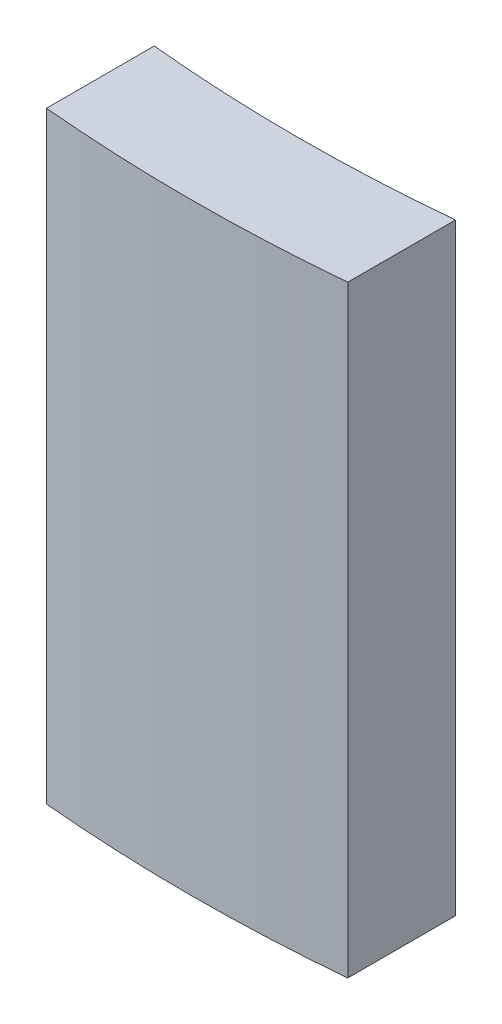
ISO-10303-21;
HEADER;
FILE_DESCRIPTION(('STEP AP214'),'2;1');
FILE_NAME('part.step','',(''),(''),'','','');
FILE_SCHEMA(('AUTOMOTIVE_DESIGN { 1 0 10303 214 1 1 1 1 }'));
ENDSEC;
DATA;
#1=APPLICATION_CONTEXT('core data for automotive mechanical design processes');
#2=APPLICATION_PROTOCOL_DEFINITION('international standard','automotive_design',2000,#1);
#3=PRODUCT_CONTEXT('',#1,'mechanical');
#4=PRODUCT('Part','Part','',(#3));
#5=PRODUCT_RELATED_PRODUCT_CATEGORY('part','',(#4));
#6=PRODUCT_DEFINITION_FORMATION('','',#4);
#7=PRODUCT_DEFINITION_CONTEXT('part definition',#1,'design');
#8=PRODUCT_DEFINITION('design','',#6,#7);
#9=PRODUCT_DEFINITION_SHAPE('','',#8);
#10=(LENGTH_UNIT() NAMED_UNIT(*) SI_UNIT(.MILLI.,.METRE.));
#11=(NAMED_UNIT(*) PLANE_ANGLE_UNIT() SI_UNIT($,.RADIAN.));
#12=(NAMED_UNIT(*) SI_UNIT($,.STERADIAN.) SOLID_ANGLE_UNIT());
#13=UNCERTAINTY_MEASURE_WITH_UNIT(LENGTH_MEASURE(1.E-05),#10,'distance_accuracy_value','');
#14=(GEOMETRIC_REPRESENTATION_CONTEXT(3) GLOBAL_UNCERTAINTY_ASSIGNED_CONTEXT((#13)) GLOBAL_UNIT_ASSIGNED_CONTEXT((#10,
#11,#12)) REPRESENTATION_CONTEXT('',''));
#15=CARTESIAN_POINT('',(0.,0.,0.));
#16=DIRECTION('',(0.,0.,1.));
#17=DIRECTION('',(1.,0.,0.));
#18=AXIS2_PLACEMENT_3D('',#15,#16,#17);
#19=CARTESIAN_POINT('',(0.,-6.,-30.8131452317513));
#20=DIRECTION('',(0.,1.,0.));
#21=DIRECTION('',(0.,0.,1.));
#22=AXIS2_PLACEMENT_3D('',#19,#20,#21);
#23=CYLINDRICAL_SURFACE('',#22,30.8131452317513);
#24=CARTESIAN_POINT('',(0.,-6.,-30.8131452317513));
#25=DIRECTION('',(0.,-1.,0.));
#26=DIRECTION('',(0.,0.,1.));
#27=AXIS2_PLACEMENT_3D('',#24,#25,#26);
#28=CIRCLE('',#27,30.8131452317513);
#29=CARTESIAN_POINT('',(3.,-6.,-0.146389304966382));
#30=VERTEX_POINT('',#29);
#31=CARTESIAN_POINT('',(-3.00000000000001,-6.,-0.146389304966382));
#32=VERTEX_POINT('',#31);
#33=EDGE_CURVE('E70',#30,#32,#28,.T.);
#34=ORIENTED_EDGE('',*,*,#33,.T.);
#35=DIRECTION('',(0.,1.,0.));
#36=VECTOR('',#35,1.);
#37=CARTESIAN_POINT('',(-3.00000000000001,-6.,-0.146389304966382));
#38=LINE('',#37,#36);
#39=CARTESIAN_POINT('',(-3.00000000000001,6.,-0.146389304966382));
#40=VERTEX_POINT('',#39);
#41=EDGE_CURVE('E98',#32,#40,#38,.T.);
#42=ORIENTED_EDGE('',*,*,#41,.T.);
#43=CARTESIAN_POINT('',(0.,6.,-30.8131452317513));
#44=DIRECTION('',(0.,-1.,0.));
#45=DIRECTION('',(0.,0.,1.));
#46=AXIS2_PLACEMENT_3D('',#43,#44,#45);
#47=CIRCLE('',#46,30.8131452317513);
#48=CARTESIAN_POINT('',(3.,6.,-0.146389304966382));
#49=VERTEX_POINT('',#48);
#50=EDGE_CURVE('E90',#49,#40,#47,.T.);
#51=ORIENTED_EDGE('',*,*,#50,.F.);
#52=DIRECTION('',(0.,1.,0.));
#53=VECTOR('',#52,1.);
#54=CARTESIAN_POINT('',(3.,-6.,-0.146389304966382));
#55=LINE('',#54,#53);
#56=EDGE_CURVE('E100',#30,#49,#55,.T.);
#57=ORIENTED_EDGE('',*,*,#56,.F.);
#58=EDGE_LOOP('',(#34,#42,#51,#57));
#59=FACE_BOUND('',#58,.T.);
#60=ADVANCED_FACE('F33',(#59),#23,.F.);
#61=CARTESIAN_POINT('',(3.,6.,2.));
#62=DIRECTION('',(-1.,0.,0.));
#63=DIRECTION('',(0.,-1.,0.));
#64=AXIS2_PLACEMENT_3D('',#61,#62,#63);
#65=PLANE('',#64);
#66=DIRECTION('',(0.,0.,-1.));
#67=VECTOR('',#66,1.);
#68=CARTESIAN_POINT('',(3.,6.,2.));
#69=LINE('',#68,#67);
#70=CARTESIAN_POINT('',(3.,6.,2.));
#71=VERTEX_POINT('',#70);
#72=EDGE_CURVE('E37',#49,#71,#69,.F.);
#73=ORIENTED_EDGE('',*,*,#72,.T.);
#74=DIRECTION('',(0.,1.,0.));
#75=VECTOR('',#74,1.);
#76=CARTESIAN_POINT('',(3.,0.,2.));
#77=LINE('',#76,#75);
#78=CARTESIAN_POINT('',(3.,-6.,2.));
#79=VERTEX_POINT('',#78);
#80=EDGE_CURVE('E43',#79,#71,#77,.T.);
#81=ORIENTED_EDGE('',*,*,#80,.F.);
#82=DIRECTION('',(0.,0.,1.));
#83=VECTOR('',#82,1.);
#84=CARTESIAN_POINT('',(3.,-6.,2.));
#85=LINE('',#84,#83);
#86=EDGE_CURVE('E104',#79,#30,#85,.F.);
#87=ORIENTED_EDGE('',*,*,#86,.T.);
#88=ORIENTED_EDGE('',*,*,#56,.T.);
#89=EDGE_LOOP('',(#73,#81,#87,#88));
#90=FACE_BOUND('',#89,.T.);
#91=ADVANCED_FACE('F35',(#90),#65,.F.);
#92=CARTESIAN_POINT('',(-3.,6.,2.));
#93=DIRECTION('',(0.,-1.,0.));
#94=DIRECTION('',(0.,0.,-1.));
#95=AXIS2_PLACEMENT_3D('',#92,#93,#94);
#96=PLANE('',#95);
#97=DIRECTION('',(0.,0.,1.));
#98=VECTOR('',#97,1.);
#99=CARTESIAN_POINT('',(-3.,6.,2.));
#100=LINE('',#99,#98);
#101=CARTESIAN_POINT('',(-3.,6.,2.));
#102=VERTEX_POINT('',#101);
#103=EDGE_CURVE('E78',#40,#102,#100,.T.);
#104=ORIENTED_EDGE('',*,*,#103,.T.);
#105=CARTESIAN_POINT('',(0.,6.,-30.8131452317513));
#106=DIRECTION('',(0.,1.,0.));
#107=DIRECTION('',(0.,0.,-1.));
#108=AXIS2_PLACEMENT_3D('',#105,#106,#107);
#109=CIRCLE('',#108,32.95);
#110=EDGE_CURVE('E89',#102,#71,#109,.T.);
#111=ORIENTED_EDGE('',*,*,#110,.T.);
#112=ORIENTED_EDGE('',*,*,#72,.F.);
#113=ORIENTED_EDGE('',*,*,#50,.T.);
#114=EDGE_LOOP('',(#104,#111,#112,#113));
#115=FACE_BOUND('',#114,.T.);
#116=ADVANCED_FACE('F87',(#115),#96,.F.);
#117=CARTESIAN_POINT('',(-3.,6.,2.));
#118=DIRECTION('',(1.,0.,0.));
#119=DIRECTION('',(0.,1.,0.));
#120=AXIS2_PLACEMENT_3D('',#117,#118,#119);
#121=PLANE('',#120);
#122=DIRECTION('',(0.,0.,1.));
#123=VECTOR('',#122,1.);
#124=CARTESIAN_POINT('',(-3.,-6.,2.));
#125=LINE('',#124,#123);
#126=CARTESIAN_POINT('',(-3.,-6.,2.));
#127=VERTEX_POINT('',#126);
#128=EDGE_CURVE('E51',#32,#127,#125,.T.);
#129=ORIENTED_EDGE('',*,*,#128,.T.);
#130=DIRECTION('',(0.,1.,0.));
#131=VECTOR('',#130,1.);
#132=CARTESIAN_POINT('',(-3.,0.,2.));
#133=LINE('',#132,#131);
#134=EDGE_CURVE('E11',#102,#127,#133,.F.);
#135=ORIENTED_EDGE('',*,*,#134,.F.);
#136=ORIENTED_EDGE('',*,*,#103,.F.);
#137=ORIENTED_EDGE('',*,*,#41,.F.);
#138=EDGE_LOOP('',(#129,#135,#136,#137));
#139=FACE_BOUND('',#138,.T.);
#140=ADVANCED_FACE('F80',(#139),#121,.F.);
#141=CARTESIAN_POINT('',(-3.,-6.,2.));
#142=DIRECTION('',(0.,1.,0.));
#143=DIRECTION('',(0.,0.,1.));
#144=AXIS2_PLACEMENT_3D('',#141,#142,#143);
#145=PLANE('',#144);
#146=ORIENTED_EDGE('',*,*,#86,.F.);
#147=CARTESIAN_POINT('',(0.,-6.,-30.8131452317513));
#148=DIRECTION('',(0.,1.,0.));
#149=DIRECTION('',(0.,0.,-1.));
#150=AXIS2_PLACEMENT_3D('',#147,#148,#149);
#151=CIRCLE('',#150,32.95);
#152=EDGE_CURVE('E93',#127,#79,#151,.T.);
#153=ORIENTED_EDGE('',*,*,#152,.F.);
#154=ORIENTED_EDGE('',*,*,#128,.F.);
#155=ORIENTED_EDGE('',*,*,#33,.F.);
#156=EDGE_LOOP('',(#146,#153,#154,#155));
#157=FACE_BOUND('',#156,.T.);
#158=ADVANCED_FACE('F107',(#157),#145,.F.);
#159=CARTESIAN_POINT('',(0.,-6.,-30.8131452317513));
#160=DIRECTION('',(0.,1.,0.));
#161=DIRECTION('',(0.,0.,1.));
#162=AXIS2_PLACEMENT_3D('',#159,#160,#161);
#163=CYLINDRICAL_SURFACE('',#162,32.95);
#164=ORIENTED_EDGE('',*,*,#110,.F.);
#165=ORIENTED_EDGE('',*,*,#134,.T.);
#166=ORIENTED_EDGE('',*,*,#152,.T.);
#167=ORIENTED_EDGE('',*,*,#80,.T.);
#168=EDGE_LOOP('',(#164,#165,#166,#167));
#169=FACE_BOUND('',#168,.T.);
#170=ADVANCED_FACE('F91',(#169),#163,.T.);
#171=CLOSED_SHELL('',(#60,#91,#116,#140,#158,#170));
#172=MANIFOLD_SOLID_BREP('B2',#171);
#173=ADVANCED_BREP_SHAPE_REPRESENTATION('',(#18,#172),#14);
#174=SHAPE_DEFINITION_REPRESENTATION(#9,#173);
ENDSEC;
END-ISO-10303-21;
